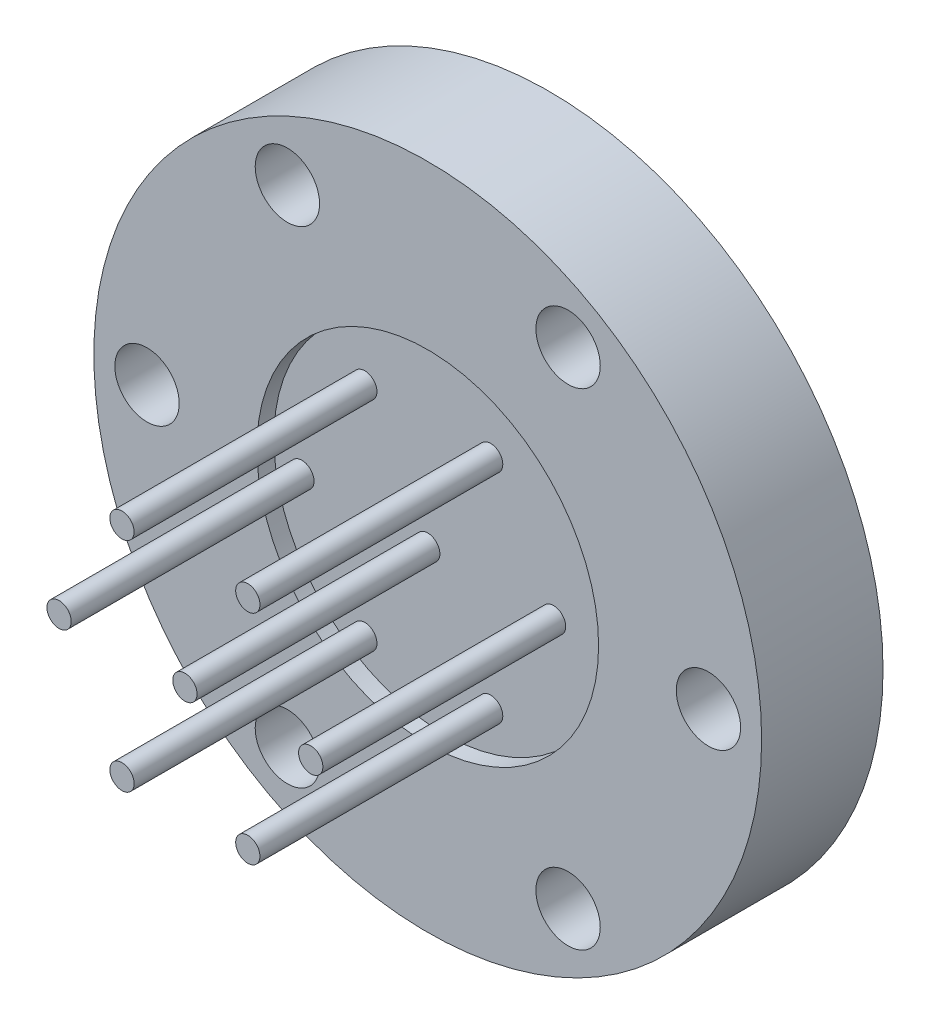
ISO-10303-21;
HEADER;
FILE_DESCRIPTION(('STEP AP214'),'2;1');
FILE_NAME('part.step','',(''),(''),'','','');
FILE_SCHEMA(('AUTOMOTIVE_DESIGN { 1 0 10303 214 1 1 1 1 }'));
ENDSEC;
DATA;
#1=APPLICATION_CONTEXT('core data for automotive mechanical design processes');
#2=APPLICATION_PROTOCOL_DEFINITION('international standard','automotive_design',2000,#1);
#3=PRODUCT_CONTEXT('',#1,'mechanical');
#4=PRODUCT('Part','Part','',(#3));
#5=PRODUCT_RELATED_PRODUCT_CATEGORY('part','',(#4));
#6=PRODUCT_DEFINITION_FORMATION('','',#4);
#7=PRODUCT_DEFINITION_CONTEXT('part definition',#1,'design');
#8=PRODUCT_DEFINITION('design','',#6,#7);
#9=PRODUCT_DEFINITION_SHAPE('','',#8);
#10=(LENGTH_UNIT() NAMED_UNIT(*) SI_UNIT(.MILLI.,.METRE.));
#11=(NAMED_UNIT(*) PLANE_ANGLE_UNIT() SI_UNIT($,.RADIAN.));
#12=(NAMED_UNIT(*) SI_UNIT($,.STERADIAN.) SOLID_ANGLE_UNIT());
#13=UNCERTAINTY_MEASURE_WITH_UNIT(LENGTH_MEASURE(1.E-05),#10,'distance_accuracy_value','');
#14=(GEOMETRIC_REPRESENTATION_CONTEXT(3) GLOBAL_UNCERTAINTY_ASSIGNED_CONTEXT((#13)) GLOBAL_UNIT_ASSIGNED_CONTEXT((#10,
#11,#12)) REPRESENTATION_CONTEXT('',''));
#15=CARTESIAN_POINT('',(0.,0.,0.));
#16=DIRECTION('',(0.,0.,1.));
#17=DIRECTION('',(1.,0.,0.));
#18=AXIS2_PLACEMENT_3D('',#15,#16,#17);
#19=CARTESIAN_POINT('',(0.,0.,12.7));
#20=DIRECTION('',(0.,0.,1.));
#21=DIRECTION('',(1.,0.,0.));
#22=AXIS2_PLACEMENT_3D('',#19,#20,#21);
#23=PLANE('',#22);
#24=CARTESIAN_POINT('',(29.3624,0.,12.7));
#25=DIRECTION('',(0.,0.,1.));
#26=DIRECTION('',(1.,0.,0.));
#27=AXIS2_PLACEMENT_3D('',#24,#25,#26);
#28=CIRCLE('',#27,3.3655);
#29=CARTESIAN_POINT('',(32.7279,0.,12.7));
#30=VERTEX_POINT('',#29);
#31=EDGE_CURVE('E95',#30,#30,#28,.T.);
#32=ORIENTED_EDGE('',*,*,#31,.F.);
#33=EDGE_LOOP('',(#32));
#34=FACE_BOUND('',#33,.T.);
#35=CARTESIAN_POINT('',(14.6812,-25.4285843160802,12.7));
#36=DIRECTION('',(0.,0.,1.));
#37=DIRECTION('',(1.,0.,0.));
#38=AXIS2_PLACEMENT_3D('',#35,#36,#37);
#39=CIRCLE('',#38,3.3655);
#40=CARTESIAN_POINT('',(18.0467,-25.4285843160802,12.7));
#41=VERTEX_POINT('',#40);
#42=EDGE_CURVE('E89',#41,#41,#39,.T.);
#43=ORIENTED_EDGE('',*,*,#42,.F.);
#44=EDGE_LOOP('',(#43));
#45=FACE_BOUND('',#44,.T.);
#46=CARTESIAN_POINT('',(-14.6812,-25.4285843160802,12.7));
#47=DIRECTION('',(0.,0.,1.));
#48=DIRECTION('',(1.,0.,0.));
#49=AXIS2_PLACEMENT_3D('',#46,#47,#48);
#50=CIRCLE('',#49,3.3655);
#51=CARTESIAN_POINT('',(-11.3157,-25.4285843160802,12.7));
#52=VERTEX_POINT('',#51);
#53=EDGE_CURVE('E83',#52,#52,#50,.T.);
#54=ORIENTED_EDGE('',*,*,#53,.F.);
#55=EDGE_LOOP('',(#54));
#56=FACE_BOUND('',#55,.T.);
#57=CARTESIAN_POINT('',(-29.3624,0.,12.7));
#58=DIRECTION('',(0.,0.,1.));
#59=DIRECTION('',(1.,0.,0.));
#60=AXIS2_PLACEMENT_3D('',#57,#58,#59);
#61=CIRCLE('',#60,3.3655);
#62=CARTESIAN_POINT('',(-25.9969,0.,12.7));
#63=VERTEX_POINT('',#62);
#64=EDGE_CURVE('E77',#63,#63,#61,.T.);
#65=ORIENTED_EDGE('',*,*,#64,.F.);
#66=EDGE_LOOP('',(#65));
#67=FACE_BOUND('',#66,.T.);
#68=CARTESIAN_POINT('',(-14.6812,25.4285843160802,12.7));
#69=DIRECTION('',(0.,0.,1.));
#70=DIRECTION('',(1.,0.,0.));
#71=AXIS2_PLACEMENT_3D('',#68,#69,#70);
#72=CIRCLE('',#71,3.3655);
#73=CARTESIAN_POINT('',(-11.3157,25.4285843160802,12.7));
#74=VERTEX_POINT('',#73);
#75=EDGE_CURVE('E71',#74,#74,#72,.T.);
#76=ORIENTED_EDGE('',*,*,#75,.F.);
#77=EDGE_LOOP('',(#76));
#78=FACE_BOUND('',#77,.T.);
#79=CARTESIAN_POINT('',(14.6812,25.4285843160802,12.7));
#80=DIRECTION('',(0.,0.,1.));
#81=DIRECTION('',(1.,0.,0.));
#82=AXIS2_PLACEMENT_3D('',#79,#80,#81);
#83=CIRCLE('',#82,3.3655);
#84=CARTESIAN_POINT('',(18.0467,25.4285843160802,12.7));
#85=VERTEX_POINT('',#84);
#86=EDGE_CURVE('E65',#85,#85,#83,.T.);
#87=ORIENTED_EDGE('',*,*,#86,.F.);
#88=EDGE_LOOP('',(#87));
#89=FACE_BOUND('',#88,.T.);
#90=CARTESIAN_POINT('',(0.,0.,12.7));
#91=DIRECTION('',(0.,0.,1.));
#92=DIRECTION('',(1.,0.,0.));
#93=AXIS2_PLACEMENT_3D('',#90,#91,#92);
#94=CIRCLE('',#93,17.8731162955844);
#95=CARTESIAN_POINT('',(17.8731162955844,0.,12.7));
#96=VERTEX_POINT('',#95);
#97=EDGE_CURVE('E45',#96,#96,#94,.T.);
#98=ORIENTED_EDGE('',*,*,#97,.F.);
#99=EDGE_LOOP('',(#98));
#100=FACE_BOUND('',#99,.T.);
#101=CARTESIAN_POINT('',(0.,0.,12.7));
#102=DIRECTION('',(0.,0.,1.));
#103=DIRECTION('',(1.,0.,0.));
#104=AXIS2_PLACEMENT_3D('',#101,#102,#103);
#105=CIRCLE('',#104,34.925);
#106=CARTESIAN_POINT('',(34.925,0.,12.7));
#107=VERTEX_POINT('',#106);
#108=EDGE_CURVE('E62',#107,#107,#105,.T.);
#109=ORIENTED_EDGE('',*,*,#108,.T.);
#110=EDGE_LOOP('',(#109));
#111=FACE_BOUND('',#110,.T.);
#112=ADVANCED_FACE('F41',(#34,#45,#56,#67,#78,#89,#100,#111),#23,.T.);
#113=CARTESIAN_POINT('',(0.,0.,12.7));
#114=DIRECTION('',(0.,0.,-1.));
#115=DIRECTION('',(-1.,0.,0.));
#116=AXIS2_PLACEMENT_3D('',#113,#114,#115);
#117=CYLINDRICAL_SURFACE('',#116,34.925);
#118=ORIENTED_EDGE('',*,*,#108,.F.);
#119=EDGE_LOOP('',(#118));
#120=FACE_BOUND('',#119,.T.);
#121=CARTESIAN_POINT('',(0.,0.,0.));
#122=DIRECTION('',(0.,0.,1.));
#123=DIRECTION('',(1.,0.,0.));
#124=AXIS2_PLACEMENT_3D('',#121,#122,#123);
#125=CIRCLE('',#124,34.925);
#126=CARTESIAN_POINT('',(34.925,0.,0.));
#127=VERTEX_POINT('',#126);
#128=EDGE_CURVE('E57',#127,#127,#125,.T.);
#129=ORIENTED_EDGE('',*,*,#128,.T.);
#130=EDGE_LOOP('',(#129));
#131=FACE_BOUND('',#130,.T.);
#132=ADVANCED_FACE('F108',(#120,#131),#117,.T.);
#133=CARTESIAN_POINT('',(0.,0.,0.));
#134=DIRECTION('',(0.,0.,1.));
#135=DIRECTION('',(1.,0.,0.));
#136=AXIS2_PLACEMENT_3D('',#133,#134,#135);
#137=PLANE('',#136);
#138=CARTESIAN_POINT('',(29.3624,0.,0.));
#139=DIRECTION('',(0.,0.,-1.));
#140=DIRECTION('',(-1.,0.,0.));
#141=AXIS2_PLACEMENT_3D('',#138,#139,#140);
#142=CIRCLE('',#141,3.3655);
#143=CARTESIAN_POINT('',(25.9969,0.,0.));
#144=VERTEX_POINT('',#143);
#145=EDGE_CURVE('E98',#144,#144,#142,.T.);
#146=ORIENTED_EDGE('',*,*,#145,.F.);
#147=EDGE_LOOP('',(#146));
#148=FACE_BOUND('',#147,.T.);
#149=CARTESIAN_POINT('',(14.6812,-25.4285843160802,0.));
#150=DIRECTION('',(0.,0.,-1.));
#151=DIRECTION('',(-1.,0.,0.));
#152=AXIS2_PLACEMENT_3D('',#149,#150,#151);
#153=CIRCLE('',#152,3.3655);
#154=CARTESIAN_POINT('',(11.3157,-25.4285843160802,0.));
#155=VERTEX_POINT('',#154);
#156=EDGE_CURVE('E92',#155,#155,#153,.T.);
#157=ORIENTED_EDGE('',*,*,#156,.F.);
#158=EDGE_LOOP('',(#157));
#159=FACE_BOUND('',#158,.T.);
#160=CARTESIAN_POINT('',(-14.6812,-25.4285843160802,0.));
#161=DIRECTION('',(0.,0.,-1.));
#162=DIRECTION('',(-1.,0.,0.));
#163=AXIS2_PLACEMENT_3D('',#160,#161,#162);
#164=CIRCLE('',#163,3.3655);
#165=CARTESIAN_POINT('',(-18.0467,-25.4285843160802,0.));
#166=VERTEX_POINT('',#165);
#167=EDGE_CURVE('E86',#166,#166,#164,.T.);
#168=ORIENTED_EDGE('',*,*,#167,.F.);
#169=EDGE_LOOP('',(#168));
#170=FACE_BOUND('',#169,.T.);
#171=CARTESIAN_POINT('',(-29.3624,0.,0.));
#172=DIRECTION('',(0.,0.,-1.));
#173=DIRECTION('',(-1.,0.,0.));
#174=AXIS2_PLACEMENT_3D('',#171,#172,#173);
#175=CIRCLE('',#174,3.3655);
#176=CARTESIAN_POINT('',(-32.7279,0.,0.));
#177=VERTEX_POINT('',#176);
#178=EDGE_CURVE('E80',#177,#177,#175,.T.);
#179=ORIENTED_EDGE('',*,*,#178,.F.);
#180=EDGE_LOOP('',(#179));
#181=FACE_BOUND('',#180,.T.);
#182=CARTESIAN_POINT('',(-14.6812,25.4285843160802,0.));
#183=DIRECTION('',(0.,0.,-1.));
#184=DIRECTION('',(-1.,0.,0.));
#185=AXIS2_PLACEMENT_3D('',#182,#183,#184);
#186=CIRCLE('',#185,3.3655);
#187=CARTESIAN_POINT('',(-18.0467,25.4285843160802,0.));
#188=VERTEX_POINT('',#187);
#189=EDGE_CURVE('E74',#188,#188,#186,.T.);
#190=ORIENTED_EDGE('',*,*,#189,.F.);
#191=EDGE_LOOP('',(#190));
#192=FACE_BOUND('',#191,.T.);
#193=CARTESIAN_POINT('',(14.6812,25.4285843160802,0.));
#194=DIRECTION('',(0.,0.,-1.));
#195=DIRECTION('',(-1.,0.,0.));
#196=AXIS2_PLACEMENT_3D('',#193,#194,#195);
#197=CIRCLE('',#196,3.3655);
#198=CARTESIAN_POINT('',(11.3157,25.4285843160802,0.));
#199=VERTEX_POINT('',#198);
#200=EDGE_CURVE('E68',#199,#199,#197,.T.);
#201=ORIENTED_EDGE('',*,*,#200,.F.);
#202=EDGE_LOOP('',(#201));
#203=FACE_BOUND('',#202,.T.);
#204=CARTESIAN_POINT('',(0.,0.,0.));
#205=DIRECTION('',(0.,0.,-1.));
#206=DIRECTION('',(-1.,0.,0.));
#207=AXIS2_PLACEMENT_3D('',#204,#205,#206);
#208=CIRCLE('',#207,23.07082);
#209=CARTESIAN_POINT('',(-23.07082,0.,0.));
#210=VERTEX_POINT('',#209);
#211=EDGE_CURVE('E54',#210,#210,#208,.T.);
#212=ORIENTED_EDGE('',*,*,#211,.F.);
#213=EDGE_LOOP('',(#212));
#214=FACE_BOUND('',#213,.T.);
#215=ORIENTED_EDGE('',*,*,#128,.F.);
#216=EDGE_LOOP('',(#215));
#217=FACE_BOUND('',#216,.T.);
#218=ADVANCED_FACE('F104',(#148,#159,#170,#181,#192,#203,#214,#217),#137,.F.);
#219=CARTESIAN_POINT('',(0.,0.,1.999996));
#220=DIRECTION('',(0.,0.,-1.));
#221=DIRECTION('',(-1.,0.,0.));
#222=AXIS2_PLACEMENT_3D('',#219,#220,#221);
#223=CYLINDRICAL_SURFACE('',#222,23.07082);
#224=CARTESIAN_POINT('',(0.,0.,1.999996));
#225=DIRECTION('',(0.,0.,-1.));
#226=DIRECTION('',(-1.,0.,0.));
#227=AXIS2_PLACEMENT_3D('',#224,#225,#226);
#228=CIRCLE('',#227,23.07082);
#229=CARTESIAN_POINT('',(-23.07082,0.,1.999996));
#230=VERTEX_POINT('',#229);
#231=EDGE_CURVE('E52',#230,#230,#228,.T.);
#232=ORIENTED_EDGE('',*,*,#231,.F.);
#233=EDGE_LOOP('',(#232));
#234=FACE_BOUND('',#233,.T.);
#235=ORIENTED_EDGE('',*,*,#211,.T.);
#236=EDGE_LOOP('',(#235));
#237=FACE_BOUND('',#236,.T.);
#238=ADVANCED_FACE('F107',(#234,#237),#223,.F.);
#239=CARTESIAN_POINT('',(0.,0.,1.999996));
#240=DIRECTION('',(0.,0.,-1.));
#241=DIRECTION('',(-1.,0.,0.));
#242=AXIS2_PLACEMENT_3D('',#239,#240,#241);
#243=PLANE('',#242);
#244=ORIENTED_EDGE('',*,*,#231,.T.);
#245=EDGE_LOOP('',(#244));
#246=FACE_BOUND('',#245,.T.);
#247=ADVANCED_FACE('F139',(#246),#243,.T.);
#248=CARTESIAN_POINT('',(0.,0.,10.922));
#249=DIRECTION('',(0.,0.,1.));
#250=DIRECTION('',(1.,0.,0.));
#251=AXIS2_PLACEMENT_3D('',#248,#249,#250);
#252=CYLINDRICAL_SURFACE('',#251,17.8731162955844);
#253=CARTESIAN_POINT('',(0.,0.,10.922));
#254=DIRECTION('',(0.,0.,1.));
#255=DIRECTION('',(1.,0.,0.));
#256=AXIS2_PLACEMENT_3D('',#253,#254,#255);
#257=CIRCLE('',#256,17.8731162955844);
#258=CARTESIAN_POINT('',(17.8731162955844,0.,10.922));
#259=VERTEX_POINT('',#258);
#260=EDGE_CURVE('E11',#259,#259,#257,.T.);
#261=ORIENTED_EDGE('',*,*,#260,.F.);
#262=EDGE_LOOP('',(#261));
#263=FACE_BOUND('',#262,.T.);
#264=ORIENTED_EDGE('',*,*,#97,.T.);
#265=EDGE_LOOP('',(#264));
#266=FACE_BOUND('',#265,.T.);
#267=ADVANCED_FACE('F142',(#263,#266),#252,.F.);
#268=CARTESIAN_POINT('',(0.,0.,10.922));
#269=DIRECTION('',(0.,0.,1.));
#270=DIRECTION('',(1.,0.,0.));
#271=AXIS2_PLACEMENT_3D('',#268,#269,#270);
#272=PLANE('',#271);
#273=ORIENTED_EDGE('',*,*,#260,.T.);
#274=EDGE_LOOP('',(#273));
#275=FACE_BOUND('',#274,.T.);
#276=ADVANCED_FACE('F43',(#275),#272,.T.);
#277=CARTESIAN_POINT('',(14.6812,25.4285843160802,38.1));
#278=DIRECTION('',(0.,0.,-1.));
#279=DIRECTION('',(-1.,0.,0.));
#280=AXIS2_PLACEMENT_3D('',#277,#278,#279);
#281=CYLINDRICAL_SURFACE('',#280,3.3655);
#282=ORIENTED_EDGE('',*,*,#86,.T.);
#283=EDGE_LOOP('',(#282));
#284=FACE_BOUND('',#283,.T.);
#285=ORIENTED_EDGE('',*,*,#200,.T.);
#286=EDGE_LOOP('',(#285));
#287=FACE_BOUND('',#286,.T.);
#288=ADVANCED_FACE('F134',(#284,#287),#281,.F.);
#289=CARTESIAN_POINT('',(-14.6812,25.4285843160802,38.1));
#290=DIRECTION('',(0.,0.,-1.));
#291=DIRECTION('',(-1.,0.,0.));
#292=AXIS2_PLACEMENT_3D('',#289,#290,#291);
#293=CYLINDRICAL_SURFACE('',#292,3.3655);
#294=ORIENTED_EDGE('',*,*,#75,.T.);
#295=EDGE_LOOP('',(#294));
#296=FACE_BOUND('',#295,.T.);
#297=ORIENTED_EDGE('',*,*,#189,.T.);
#298=EDGE_LOOP('',(#297));
#299=FACE_BOUND('',#298,.T.);
#300=ADVANCED_FACE('F156',(#296,#299),#293,.F.);
#301=CARTESIAN_POINT('',(-29.3624,0.,38.1));
#302=DIRECTION('',(0.,0.,-1.));
#303=DIRECTION('',(-1.,0.,0.));
#304=AXIS2_PLACEMENT_3D('',#301,#302,#303);
#305=CYLINDRICAL_SURFACE('',#304,3.3655);
#306=ORIENTED_EDGE('',*,*,#64,.T.);
#307=EDGE_LOOP('',(#306));
#308=FACE_BOUND('',#307,.T.);
#309=ORIENTED_EDGE('',*,*,#178,.T.);
#310=EDGE_LOOP('',(#309));
#311=FACE_BOUND('',#310,.T.);
#312=ADVANCED_FACE('F161',(#308,#311),#305,.F.);
#313=CARTESIAN_POINT('',(-14.6812,-25.4285843160802,38.1));
#314=DIRECTION('',(0.,0.,-1.));
#315=DIRECTION('',(-1.,0.,0.));
#316=AXIS2_PLACEMENT_3D('',#313,#314,#315);
#317=CYLINDRICAL_SURFACE('',#316,3.3655);
#318=ORIENTED_EDGE('',*,*,#53,.T.);
#319=EDGE_LOOP('',(#318));
#320=FACE_BOUND('',#319,.T.);
#321=ORIENTED_EDGE('',*,*,#167,.T.);
#322=EDGE_LOOP('',(#321));
#323=FACE_BOUND('',#322,.T.);
#324=ADVANCED_FACE('F169',(#320,#323),#317,.F.);
#325=CARTESIAN_POINT('',(14.6812,-25.4285843160802,38.1));
#326=DIRECTION('',(0.,0.,-1.));
#327=DIRECTION('',(-1.,0.,0.));
#328=AXIS2_PLACEMENT_3D('',#325,#326,#327);
#329=CYLINDRICAL_SURFACE('',#328,3.3655);
#330=ORIENTED_EDGE('',*,*,#42,.T.);
#331=EDGE_LOOP('',(#330));
#332=FACE_BOUND('',#331,.T.);
#333=ORIENTED_EDGE('',*,*,#156,.T.);
#334=EDGE_LOOP('',(#333));
#335=FACE_BOUND('',#334,.T.);
#336=ADVANCED_FACE('F176',(#332,#335),#329,.F.);
#337=CARTESIAN_POINT('',(29.3624,0.,38.1));
#338=DIRECTION('',(0.,0.,-1.));
#339=DIRECTION('',(-1.,0.,0.));
#340=AXIS2_PLACEMENT_3D('',#337,#338,#339);
#341=CYLINDRICAL_SURFACE('',#340,3.3655);
#342=ORIENTED_EDGE('',*,*,#31,.T.);
#343=EDGE_LOOP('',(#342));
#344=FACE_BOUND('',#343,.T.);
#345=ORIENTED_EDGE('',*,*,#145,.T.);
#346=EDGE_LOOP('',(#345));
#347=FACE_BOUND('',#346,.T.);
#348=ADVANCED_FACE('F102',(#344,#347),#341,.F.);
#349=CLOSED_SHELL('',(#112,#132,#218,#238,#247,#267,#276,#288,#300,#312,#324,#336,#348));
#350=MANIFOLD_SOLID_BREP('B2',#349);
#351=CARTESIAN_POINT('',(6.58066823605981,-11.3980517326099,38.1));
#352=DIRECTION('',(0.,0.,1.));
#353=DIRECTION('',(1.,0.,0.));
#354=AXIS2_PLACEMENT_3D('',#351,#352,#353);
#355=PLANE('',#354);
#356=CARTESIAN_POINT('',(6.58066823605981,-11.3980517326099,38.1));
#357=DIRECTION('',(0.,0.,1.));
#358=DIRECTION('',(1.,0.,0.));
#359=AXIS2_PLACEMENT_3D('',#356,#357,#358);
#360=CIRCLE('',#359,1.27);
#361=CARTESIAN_POINT('',(7.85066823605981,-11.3980517326099,38.1));
#362=VERTEX_POINT('',#361);
#363=EDGE_CURVE('E284',#362,#362,#360,.T.);
#364=ORIENTED_EDGE('',*,*,#363,.T.);
#365=EDGE_LOOP('',(#364));
#366=FACE_BOUND('',#365,.T.);
#367=ADVANCED_FACE('F277',(#366),#355,.T.);
#368=CARTESIAN_POINT('',(6.58066823605981,-11.3980517326099,38.1));
#369=DIRECTION('',(0.,0.,-1.));
#370=DIRECTION('',(-1.,0.,0.));
#371=AXIS2_PLACEMENT_3D('',#368,#369,#370);
#372=CYLINDRICAL_SURFACE('',#371,1.27);
#373=ORIENTED_EDGE('',*,*,#363,.F.);
#374=EDGE_LOOP('',(#373));
#375=FACE_BOUND('',#374,.T.);
#376=CARTESIAN_POINT('',(6.58066823605981,-11.3980517326099,12.7));
#377=DIRECTION('',(0.,0.,1.));
#378=DIRECTION('',(1.,0.,0.));
#379=AXIS2_PLACEMENT_3D('',#376,#377,#378);
#380=CIRCLE('',#379,1.27);
#381=CARTESIAN_POINT('',(7.85066823605981,-11.3980517326099,12.7));
#382=VERTEX_POINT('',#381);
#383=EDGE_CURVE('E40',#382,#382,#380,.T.);
#384=ORIENTED_EDGE('',*,*,#383,.T.);
#385=EDGE_LOOP('',(#384));
#386=FACE_BOUND('',#385,.T.);
#387=ADVANCED_FACE('F291',(#375,#386),#372,.T.);
#388=CARTESIAN_POINT('',(0.,0.,12.7));
#389=DIRECTION('',(0.,0.,1.));
#390=DIRECTION('',(1.,0.,0.));
#391=AXIS2_PLACEMENT_3D('',#388,#389,#390);
#392=PLANE('',#391);
#393=ORIENTED_EDGE('',*,*,#383,.F.);
#394=EDGE_LOOP('',(#393));
#395=FACE_BOUND('',#394,.T.);
#396=ADVANCED_FACE('F279',(#395),#392,.F.);
#397=CLOSED_SHELL('',(#367,#387,#396));
#398=MANIFOLD_SOLID_BREP('B6',#397);
#399=CARTESIAN_POINT('',(0.,0.,38.1));
#400=DIRECTION('',(0.,0.,1.));
#401=DIRECTION('',(1.,0.,0.));
#402=AXIS2_PLACEMENT_3D('',#399,#400,#401);
#403=PLANE('',#402);
#404=CARTESIAN_POINT('',(0.,0.,38.1));
#405=DIRECTION('',(0.,0.,1.));
#406=DIRECTION('',(1.,0.,0.));
#407=AXIS2_PLACEMENT_3D('',#404,#405,#406);
#408=CIRCLE('',#407,1.27);
#409=CARTESIAN_POINT('',(1.27,0.,38.1));
#410=VERTEX_POINT('',#409);
#411=EDGE_CURVE('E276',#410,#410,#408,.T.);
#412=ORIENTED_EDGE('',*,*,#411,.T.);
#413=EDGE_LOOP('',(#412));
#414=FACE_BOUND('',#413,.T.);
#415=ADVANCED_FACE('F329',(#414),#403,.T.);
#416=CARTESIAN_POINT('',(0.,0.,38.1));
#417=DIRECTION('',(0.,0.,-1.));
#418=DIRECTION('',(-1.,0.,0.));
#419=AXIS2_PLACEMENT_3D('',#416,#417,#418);
#420=CYLINDRICAL_SURFACE('',#419,1.27);
#421=ORIENTED_EDGE('',*,*,#411,.F.);
#422=EDGE_LOOP('',(#421));
#423=FACE_BOUND('',#422,.T.);
#424=CARTESIAN_POINT('',(0.,0.,12.7));
#425=DIRECTION('',(0.,0.,1.));
#426=DIRECTION('',(1.,0.,0.));
#427=AXIS2_PLACEMENT_3D('',#424,#425,#426);
#428=CIRCLE('',#427,1.27);
#429=CARTESIAN_POINT('',(1.27,0.,12.7));
#430=VERTEX_POINT('',#429);
#431=EDGE_CURVE('E336',#430,#430,#428,.T.);
#432=ORIENTED_EDGE('',*,*,#431,.T.);
#433=EDGE_LOOP('',(#432));
#434=FACE_BOUND('',#433,.T.);
#435=ADVANCED_FACE('F331',(#423,#434),#420,.T.);
#436=CARTESIAN_POINT('',(0.,0.,12.7));
#437=DIRECTION('',(0.,0.,1.));
#438=DIRECTION('',(1.,0.,0.));
#439=AXIS2_PLACEMENT_3D('',#436,#437,#438);
#440=PLANE('',#439);
#441=ORIENTED_EDGE('',*,*,#431,.F.);
#442=EDGE_LOOP('',(#441));
#443=FACE_BOUND('',#442,.T.);
#444=ADVANCED_FACE('F343',(#443),#440,.F.);
#445=CLOSED_SHELL('',(#415,#435,#444));
#446=MANIFOLD_SOLID_BREP('B35',#445);
#447=CARTESIAN_POINT('',(-13.1613364721194,0.,38.1));
#448=DIRECTION('',(0.,0.,1.));
#449=DIRECTION('',(1.,0.,0.));
#450=AXIS2_PLACEMENT_3D('',#447,#448,#449);
#451=PLANE('',#450);
#452=CARTESIAN_POINT('',(-13.1613364721194,0.,38.1));
#453=DIRECTION('',(0.,0.,1.));
#454=DIRECTION('',(1.,0.,0.));
#455=AXIS2_PLACEMENT_3D('',#452,#453,#454);
#456=CIRCLE('',#455,1.27);
#457=CARTESIAN_POINT('',(-11.8913364721194,0.,38.1));
#458=VERTEX_POINT('',#457);
#459=EDGE_CURVE('E388',#458,#458,#456,.T.);
#460=ORIENTED_EDGE('',*,*,#459,.T.);
#461=EDGE_LOOP('',(#460));
#462=FACE_BOUND('',#461,.T.);
#463=ADVANCED_FACE('F381',(#462),#451,.T.);
#464=CARTESIAN_POINT('',(-13.1613364721194,0.,38.1));
#465=DIRECTION('',(0.,0.,-1.));
#466=DIRECTION('',(-1.,0.,0.));
#467=AXIS2_PLACEMENT_3D('',#464,#465,#466);
#468=CYLINDRICAL_SURFACE('',#467,1.27);
#469=ORIENTED_EDGE('',*,*,#459,.F.);
#470=EDGE_LOOP('',(#469));
#471=FACE_BOUND('',#470,.T.);
#472=CARTESIAN_POINT('',(-13.1613364721194,0.,12.7));
#473=DIRECTION('',(0.,0.,1.));
#474=DIRECTION('',(1.,0.,0.));
#475=AXIS2_PLACEMENT_3D('',#472,#473,#474);
#476=CIRCLE('',#475,1.27);
#477=CARTESIAN_POINT('',(-11.8913364721194,0.,12.7));
#478=VERTEX_POINT('',#477);
#479=EDGE_CURVE('E328',#478,#478,#476,.T.);
#480=ORIENTED_EDGE('',*,*,#479,.T.);
#481=EDGE_LOOP('',(#480));
#482=FACE_BOUND('',#481,.T.);
#483=ADVANCED_FACE('F395',(#471,#482),#468,.T.);
#484=CARTESIAN_POINT('',(0.,0.,12.7));
#485=DIRECTION('',(0.,0.,1.));
#486=DIRECTION('',(1.,0.,0.));
#487=AXIS2_PLACEMENT_3D('',#484,#485,#486);
#488=PLANE('',#487);
#489=ORIENTED_EDGE('',*,*,#479,.F.);
#490=EDGE_LOOP('',(#489));
#491=FACE_BOUND('',#490,.T.);
#492=ADVANCED_FACE('F383',(#491),#488,.F.);
#493=CLOSED_SHELL('',(#463,#483,#492));
#494=MANIFOLD_SOLID_BREP('B271',#493);
#495=CARTESIAN_POINT('',(-6.58066823605957,-11.3980517326101,38.1));
#496=DIRECTION('',(0.,0.,1.));
#497=DIRECTION('',(1.,0.,0.));
#498=AXIS2_PLACEMENT_3D('',#495,#496,#497);
#499=PLANE('',#498);
#500=CARTESIAN_POINT('',(-6.58066823605957,-11.3980517326101,38.1));
#501=DIRECTION('',(0.,0.,1.));
#502=DIRECTION('',(1.,0.,0.));
#503=AXIS2_PLACEMENT_3D('',#500,#501,#502);
#504=CIRCLE('',#503,1.27);
#505=CARTESIAN_POINT('',(-5.31066823605957,-11.3980517326101,38.1));
#506=VERTEX_POINT('',#505);
#507=EDGE_CURVE('E440',#506,#506,#504,.T.);
#508=ORIENTED_EDGE('',*,*,#507,.T.);
#509=EDGE_LOOP('',(#508));
#510=FACE_BOUND('',#509,.T.);
#511=ADVANCED_FACE('F433',(#510),#499,.T.);
#512=CARTESIAN_POINT('',(-6.58066823605957,-11.3980517326101,38.1));
#513=DIRECTION('',(0.,0.,-1.));
#514=DIRECTION('',(-1.,0.,0.));
#515=AXIS2_PLACEMENT_3D('',#512,#513,#514);
#516=CYLINDRICAL_SURFACE('',#515,1.27);
#517=ORIENTED_EDGE('',*,*,#507,.F.);
#518=EDGE_LOOP('',(#517));
#519=FACE_BOUND('',#518,.T.);
#520=CARTESIAN_POINT('',(-6.58066823605957,-11.3980517326101,12.7));
#521=DIRECTION('',(0.,0.,1.));
#522=DIRECTION('',(1.,0.,0.));
#523=AXIS2_PLACEMENT_3D('',#520,#521,#522);
#524=CIRCLE('',#523,1.27);
#525=CARTESIAN_POINT('',(-5.31066823605957,-11.3980517326101,12.7));
#526=VERTEX_POINT('',#525);
#527=EDGE_CURVE('E380',#526,#526,#524,.T.);
#528=ORIENTED_EDGE('',*,*,#527,.T.);
#529=EDGE_LOOP('',(#528));
#530=FACE_BOUND('',#529,.T.);
#531=ADVANCED_FACE('F447',(#519,#530),#516,.T.);
#532=CARTESIAN_POINT('',(0.,0.,12.7));
#533=DIRECTION('',(0.,0.,1.));
#534=DIRECTION('',(1.,0.,0.));
#535=AXIS2_PLACEMENT_3D('',#532,#533,#534);
#536=PLANE('',#535);
#537=ORIENTED_EDGE('',*,*,#527,.F.);
#538=EDGE_LOOP('',(#537));
#539=FACE_BOUND('',#538,.T.);
#540=ADVANCED_FACE('F435',(#539),#536,.F.);
#541=CLOSED_SHELL('',(#511,#531,#540));
#542=MANIFOLD_SOLID_BREP('B323',#541);
#543=CARTESIAN_POINT('',(-6.58066823605973,11.39805173261,38.1));
#544=DIRECTION('',(0.,0.,1.));
#545=DIRECTION('',(1.,0.,0.));
#546=AXIS2_PLACEMENT_3D('',#543,#544,#545);
#547=PLANE('',#546);
#548=CARTESIAN_POINT('',(-6.58066823605973,11.39805173261,38.1));
#549=DIRECTION('',(0.,0.,1.));
#550=DIRECTION('',(1.,0.,0.));
#551=AXIS2_PLACEMENT_3D('',#548,#549,#550);
#552=CIRCLE('',#551,1.27);
#553=CARTESIAN_POINT('',(-5.31066823605973,11.39805173261,38.1));
#554=VERTEX_POINT('',#553);
#555=EDGE_CURVE('E492',#554,#554,#552,.T.);
#556=ORIENTED_EDGE('',*,*,#555,.T.);
#557=EDGE_LOOP('',(#556));
#558=FACE_BOUND('',#557,.T.);
#559=ADVANCED_FACE('F485',(#558),#547,.T.);
#560=CARTESIAN_POINT('',(-6.58066823605973,11.39805173261,38.1));
#561=DIRECTION('',(0.,0.,-1.));
#562=DIRECTION('',(-1.,0.,0.));
#563=AXIS2_PLACEMENT_3D('',#560,#561,#562);
#564=CYLINDRICAL_SURFACE('',#563,1.27);
#565=ORIENTED_EDGE('',*,*,#555,.F.);
#566=EDGE_LOOP('',(#565));
#567=FACE_BOUND('',#566,.T.);
#568=CARTESIAN_POINT('',(-6.58066823605973,11.39805173261,12.7));
#569=DIRECTION('',(0.,0.,1.));
#570=DIRECTION('',(1.,0.,0.));
#571=AXIS2_PLACEMENT_3D('',#568,#569,#570);
#572=CIRCLE('',#571,1.27);
#573=CARTESIAN_POINT('',(-5.31066823605973,11.39805173261,12.7));
#574=VERTEX_POINT('',#573);
#575=EDGE_CURVE('E432',#574,#574,#572,.T.);
#576=ORIENTED_EDGE('',*,*,#575,.T.);
#577=EDGE_LOOP('',(#576));
#578=FACE_BOUND('',#577,.T.);
#579=ADVANCED_FACE('F499',(#567,#578),#564,.T.);
#580=CARTESIAN_POINT('',(0.,0.,12.7));
#581=DIRECTION('',(0.,0.,1.));
#582=DIRECTION('',(1.,0.,0.));
#583=AXIS2_PLACEMENT_3D('',#580,#581,#582);
#584=PLANE('',#583);
#585=ORIENTED_EDGE('',*,*,#575,.F.);
#586=EDGE_LOOP('',(#585));
#587=FACE_BOUND('',#586,.T.);
#588=ADVANCED_FACE('F487',(#587),#584,.F.);
#589=CLOSED_SHELL('',(#559,#579,#588));
#590=MANIFOLD_SOLID_BREP('B375',#589);
#591=CARTESIAN_POINT('',(13.1613364721194,0.,38.1));
#592=DIRECTION('',(0.,0.,1.));
#593=DIRECTION('',(1.,0.,0.));
#594=AXIS2_PLACEMENT_3D('',#591,#592,#593);
#595=PLANE('',#594);
#596=CARTESIAN_POINT('',(13.1613364721194,0.,38.1));
#597=DIRECTION('',(0.,0.,1.));
#598=DIRECTION('',(1.,0.,0.));
#599=AXIS2_PLACEMENT_3D('',#596,#597,#598);
#600=CIRCLE('',#599,1.27);
#601=CARTESIAN_POINT('',(14.4313364721194,0.,38.1));
#602=VERTEX_POINT('',#601);
#603=EDGE_CURVE('E543',#602,#602,#600,.T.);
#604=ORIENTED_EDGE('',*,*,#603,.T.);
#605=EDGE_LOOP('',(#604));
#606=FACE_BOUND('',#605,.T.);
#607=ADVANCED_FACE('F536',(#606),#595,.T.);
#608=CARTESIAN_POINT('',(13.1613364721194,0.,38.1));
#609=DIRECTION('',(0.,0.,-1.));
#610=DIRECTION('',(-1.,0.,0.));
#611=AXIS2_PLACEMENT_3D('',#608,#609,#610);
#612=CYLINDRICAL_SURFACE('',#611,1.27);
#613=ORIENTED_EDGE('',*,*,#603,.F.);
#614=EDGE_LOOP('',(#613));
#615=FACE_BOUND('',#614,.T.);
#616=CARTESIAN_POINT('',(13.1613364721194,0.,12.7));
#617=DIRECTION('',(0.,0.,1.));
#618=DIRECTION('',(1.,0.,0.));
#619=AXIS2_PLACEMENT_3D('',#616,#617,#618);
#620=CIRCLE('',#619,1.27);
#621=CARTESIAN_POINT('',(14.4313364721194,0.,12.7));
#622=VERTEX_POINT('',#621);
#623=EDGE_CURVE('E484',#622,#622,#620,.T.);
#624=ORIENTED_EDGE('',*,*,#623,.T.);
#625=EDGE_LOOP('',(#624));
#626=FACE_BOUND('',#625,.T.);
#627=ADVANCED_FACE('F550',(#615,#626),#612,.T.);
#628=CARTESIAN_POINT('',(0.,0.,12.7));
#629=DIRECTION('',(0.,0.,1.));
#630=DIRECTION('',(1.,0.,0.));
#631=AXIS2_PLACEMENT_3D('',#628,#629,#630);
#632=PLANE('',#631);
#633=ORIENTED_EDGE('',*,*,#623,.F.);
#634=EDGE_LOOP('',(#633));
#635=FACE_BOUND('',#634,.T.);
#636=ADVANCED_FACE('F538',(#635),#632,.F.);
#637=CLOSED_SHELL('',(#607,#627,#636));
#638=MANIFOLD_SOLID_BREP('B427',#637);
#639=CARTESIAN_POINT('',(6.58066823605965,11.39805173261,38.1));
#640=DIRECTION('',(0.,0.,1.));
#641=DIRECTION('',(1.,0.,0.));
#642=AXIS2_PLACEMENT_3D('',#639,#640,#641);
#643=PLANE('',#642);
#644=CARTESIAN_POINT('',(6.58066823605965,11.39805173261,38.1));
#645=DIRECTION('',(0.,0.,1.));
#646=DIRECTION('',(1.,0.,0.));
#647=AXIS2_PLACEMENT_3D('',#644,#645,#646);
#648=CIRCLE('',#647,1.27);
#649=CARTESIAN_POINT('',(7.85066823605965,11.39805173261,38.1));
#650=VERTEX_POINT('',#649);
#651=EDGE_CURVE('E587',#650,#650,#648,.T.);
#652=ORIENTED_EDGE('',*,*,#651,.T.);
#653=EDGE_LOOP('',(#652));
#654=FACE_BOUND('',#653,.T.);
#655=ADVANCED_FACE('F580',(#654),#643,.T.);
#656=CARTESIAN_POINT('',(6.58066823605965,11.39805173261,38.1));
#657=DIRECTION('',(0.,0.,-1.));
#658=DIRECTION('',(-1.,0.,0.));
#659=AXIS2_PLACEMENT_3D('',#656,#657,#658);
#660=CYLINDRICAL_SURFACE('',#659,1.27);
#661=ORIENTED_EDGE('',*,*,#651,.F.);
#662=EDGE_LOOP('',(#661));
#663=FACE_BOUND('',#662,.T.);
#664=CARTESIAN_POINT('',(6.58066823605965,11.39805173261,12.7));
#665=DIRECTION('',(0.,0.,1.));
#666=DIRECTION('',(1.,0.,0.));
#667=AXIS2_PLACEMENT_3D('',#664,#665,#666);
#668=CIRCLE('',#667,1.27);
#669=CARTESIAN_POINT('',(7.85066823605965,11.39805173261,12.7));
#670=VERTEX_POINT('',#669);
#671=EDGE_CURVE('E535',#670,#670,#668,.T.);
#672=ORIENTED_EDGE('',*,*,#671,.T.);
#673=EDGE_LOOP('',(#672));
#674=FACE_BOUND('',#673,.T.);
#675=ADVANCED_FACE('F594',(#663,#674),#660,.T.);
#676=CARTESIAN_POINT('',(0.,0.,12.7));
#677=DIRECTION('',(0.,0.,1.));
#678=DIRECTION('',(1.,0.,0.));
#679=AXIS2_PLACEMENT_3D('',#676,#677,#678);
#680=PLANE('',#679);
#681=ORIENTED_EDGE('',*,*,#671,.F.);
#682=EDGE_LOOP('',(#681));
#683=FACE_BOUND('',#682,.T.);
#684=ADVANCED_FACE('F582',(#683),#680,.F.);
#685=CLOSED_SHELL('',(#655,#675,#684));
#686=MANIFOLD_SOLID_BREP('B479',#685);
#687=ADVANCED_BREP_SHAPE_REPRESENTATION('',(#18,#350,#398,#446,#494,#542,#590,#638,#686),#14);
#688=SHAPE_DEFINITION_REPRESENTATION(#9,#687);
ENDSEC;
END-ISO-10303-21;
